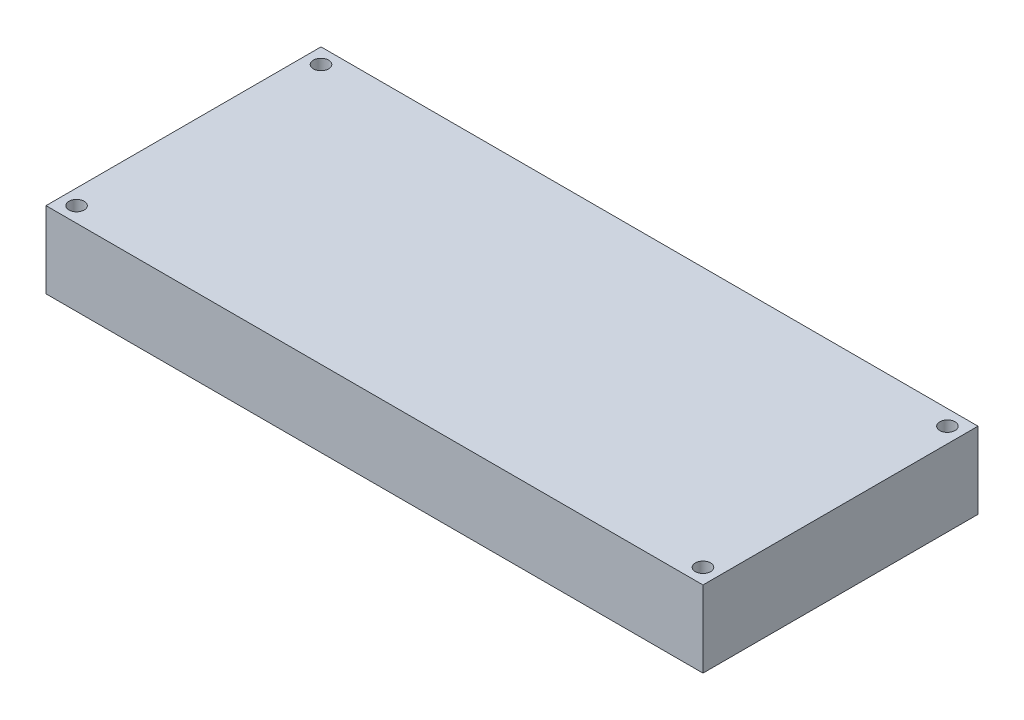
ISO-10303-21;
HEADER;
FILE_DESCRIPTION(('STEP AP214'),'2;1');
FILE_NAME('part.step','',(''),(''),'','','');
FILE_SCHEMA(('AUTOMOTIVE_DESIGN { 1 0 10303 214 1 1 1 1 }'));
ENDSEC;
DATA;
#1=APPLICATION_CONTEXT('core data for automotive mechanical design processes');
#2=APPLICATION_PROTOCOL_DEFINITION('international standard','automotive_design',2000,#1);
#3=PRODUCT_CONTEXT('',#1,'mechanical');
#4=PRODUCT('Part','Part','',(#3));
#5=PRODUCT_RELATED_PRODUCT_CATEGORY('part','',(#4));
#6=PRODUCT_DEFINITION_FORMATION('','',#4);
#7=PRODUCT_DEFINITION_CONTEXT('part definition',#1,'design');
#8=PRODUCT_DEFINITION('design','',#6,#7);
#9=PRODUCT_DEFINITION_SHAPE('','',#8);
#10=(LENGTH_UNIT() NAMED_UNIT(*) SI_UNIT(.MILLI.,.METRE.));
#11=(NAMED_UNIT(*) PLANE_ANGLE_UNIT() SI_UNIT($,.RADIAN.));
#12=(NAMED_UNIT(*) SI_UNIT($,.STERADIAN.) SOLID_ANGLE_UNIT());
#13=UNCERTAINTY_MEASURE_WITH_UNIT(LENGTH_MEASURE(1.E-05),#10,'distance_accuracy_value','');
#14=(GEOMETRIC_REPRESENTATION_CONTEXT(3) GLOBAL_UNCERTAINTY_ASSIGNED_CONTEXT((#13)) GLOBAL_UNIT_ASSIGNED_CONTEXT((#10,
#11,#12)) REPRESENTATION_CONTEXT('',''));
#15=CARTESIAN_POINT('',(0.,0.,0.));
#16=DIRECTION('',(0.,0.,1.));
#17=DIRECTION('',(1.,0.,0.));
#18=AXIS2_PLACEMENT_3D('',#15,#16,#17);
#19=CARTESIAN_POINT('',(21.5,5.,9.));
#20=DIRECTION('',(-1.,0.,0.));
#21=DIRECTION('',(0.,0.,1.));
#22=AXIS2_PLACEMENT_3D('',#19,#20,#21);
#23=PLANE('',#22);
#24=DIRECTION('',(0.,0.,-1.));
#25=VECTOR('',#24,1.);
#26=CARTESIAN_POINT('',(21.5,0.,9.));
#27=LINE('',#26,#25);
#28=CARTESIAN_POINT('',(21.5,0.,9.));
#29=VERTEX_POINT('',#28);
#30=CARTESIAN_POINT('',(21.5,0.,-9.));
#31=VERTEX_POINT('',#30);
#32=EDGE_CURVE('E99',#29,#31,#27,.T.);
#33=ORIENTED_EDGE('',*,*,#32,.T.);
#34=DIRECTION('',(0.,-1.,0.));
#35=VECTOR('',#34,1.);
#36=CARTESIAN_POINT('',(21.5,5.,-9.));
#37=LINE('',#36,#35);
#38=CARTESIAN_POINT('',(21.5,5.,-9.));
#39=VERTEX_POINT('',#38);
#40=EDGE_CURVE('E11',#39,#31,#37,.T.);
#41=ORIENTED_EDGE('',*,*,#40,.F.);
#42=DIRECTION('',(0.,0.,-1.));
#43=VECTOR('',#42,1.);
#44=CARTESIAN_POINT('',(21.5,5.,9.));
#45=LINE('',#44,#43);
#46=CARTESIAN_POINT('',(21.5,5.,9.));
#47=VERTEX_POINT('',#46);
#48=EDGE_CURVE('E87',#47,#39,#45,.T.);
#49=ORIENTED_EDGE('',*,*,#48,.F.);
#50=DIRECTION('',(0.,-1.,0.));
#51=VECTOR('',#50,1.);
#52=CARTESIAN_POINT('',(21.5,5.,9.));
#53=LINE('',#52,#51);
#54=EDGE_CURVE('E95',#47,#29,#53,.T.);
#55=ORIENTED_EDGE('',*,*,#54,.T.);
#56=EDGE_LOOP('',(#33,#41,#49,#55));
#57=FACE_BOUND('',#56,.T.);
#58=ADVANCED_FACE('F36',(#57),#23,.F.);
#59=CARTESIAN_POINT('',(-21.5,5.,-9.));
#60=DIRECTION('',(0.,0.,1.));
#61=DIRECTION('',(1.,0.,0.));
#62=AXIS2_PLACEMENT_3D('',#59,#60,#61);
#63=PLANE('',#62);
#64=DIRECTION('',(-1.,0.,0.));
#65=VECTOR('',#64,1.);
#66=CARTESIAN_POINT('',(-21.5,0.,-9.));
#67=LINE('',#66,#65);
#68=CARTESIAN_POINT('',(-21.5,0.,-9.));
#69=VERTEX_POINT('',#68);
#70=EDGE_CURVE('E91',#31,#69,#67,.T.);
#71=ORIENTED_EDGE('',*,*,#70,.T.);
#72=DIRECTION('',(0.,-1.,0.));
#73=VECTOR('',#72,1.);
#74=CARTESIAN_POINT('',(-21.5,5.,-9.));
#75=LINE('',#74,#73);
#76=CARTESIAN_POINT('',(-21.5,5.,-9.));
#77=VERTEX_POINT('',#76);
#78=EDGE_CURVE('E44',#77,#69,#75,.T.);
#79=ORIENTED_EDGE('',*,*,#78,.F.);
#80=DIRECTION('',(-1.,0.,0.));
#81=VECTOR('',#80,1.);
#82=CARTESIAN_POINT('',(-21.5,5.,-9.));
#83=LINE('',#82,#81);
#84=EDGE_CURVE('E82',#39,#77,#83,.T.);
#85=ORIENTED_EDGE('',*,*,#84,.F.);
#86=ORIENTED_EDGE('',*,*,#40,.T.);
#87=EDGE_LOOP('',(#71,#79,#85,#86));
#88=FACE_BOUND('',#87,.T.);
#89=ADVANCED_FACE('F90',(#88),#63,.F.);
#90=CARTESIAN_POINT('',(-21.5,5.,9.));
#91=DIRECTION('',(1.,0.,0.));
#92=DIRECTION('',(0.,0.,-1.));
#93=AXIS2_PLACEMENT_3D('',#90,#91,#92);
#94=PLANE('',#93);
#95=DIRECTION('',(0.,0.,1.));
#96=VECTOR('',#95,1.);
#97=CARTESIAN_POINT('',(-21.5,0.,9.));
#98=LINE('',#97,#96);
#99=CARTESIAN_POINT('',(-21.5,0.,9.));
#100=VERTEX_POINT('',#99);
#101=EDGE_CURVE('E69',#69,#100,#98,.T.);
#102=ORIENTED_EDGE('',*,*,#101,.T.);
#103=DIRECTION('',(0.,-1.,0.));
#104=VECTOR('',#103,1.);
#105=CARTESIAN_POINT('',(-21.5,5.,9.));
#106=LINE('',#105,#104);
#107=CARTESIAN_POINT('',(-21.5,5.,9.));
#108=VERTEX_POINT('',#107);
#109=EDGE_CURVE('E92',#108,#100,#106,.T.);
#110=ORIENTED_EDGE('',*,*,#109,.F.);
#111=DIRECTION('',(0.,0.,1.));
#112=VECTOR('',#111,1.);
#113=CARTESIAN_POINT('',(-21.5,5.,9.));
#114=LINE('',#113,#112);
#115=EDGE_CURVE('E85',#77,#108,#114,.T.);
#116=ORIENTED_EDGE('',*,*,#115,.F.);
#117=ORIENTED_EDGE('',*,*,#78,.T.);
#118=EDGE_LOOP('',(#102,#110,#116,#117));
#119=FACE_BOUND('',#118,.T.);
#120=ADVANCED_FACE('F93',(#119),#94,.F.);
#121=CARTESIAN_POINT('',(-21.5,5.,9.));
#122=DIRECTION('',(0.,0.,-1.));
#123=DIRECTION('',(-1.,0.,0.));
#124=AXIS2_PLACEMENT_3D('',#121,#122,#123);
#125=PLANE('',#124);
#126=DIRECTION('',(1.,0.,0.));
#127=VECTOR('',#126,1.);
#128=CARTESIAN_POINT('',(-21.5,0.,9.));
#129=LINE('',#128,#127);
#130=EDGE_CURVE('E75',#100,#29,#129,.T.);
#131=ORIENTED_EDGE('',*,*,#130,.T.);
#132=ORIENTED_EDGE('',*,*,#54,.F.);
#133=DIRECTION('',(1.,0.,0.));
#134=VECTOR('',#133,1.);
#135=CARTESIAN_POINT('',(-21.5,5.,9.));
#136=LINE('',#135,#134);
#137=EDGE_CURVE('E52',#108,#47,#136,.T.);
#138=ORIENTED_EDGE('',*,*,#137,.F.);
#139=ORIENTED_EDGE('',*,*,#109,.T.);
#140=EDGE_LOOP('',(#131,#132,#138,#139));
#141=FACE_BOUND('',#140,.T.);
#142=ADVANCED_FACE('F107',(#141),#125,.F.);
#143=CARTESIAN_POINT('',(0.,5.,0.));
#144=DIRECTION('',(0.,-1.,0.));
#145=DIRECTION('',(0.,0.,-1.));
#146=AXIS2_PLACEMENT_3D('',#143,#144,#145);
#147=PLANE('',#146);
#148=CARTESIAN_POINT('',(-20.5,5.,8.));
#149=DIRECTION('',(0.,1.,0.));
#150=DIRECTION('',(0.,0.,1.));
#151=AXIS2_PLACEMENT_3D('',#148,#149,#150);
#152=CIRCLE('',#151,0.499999999999999);
#153=CARTESIAN_POINT('',(-20.5,5.,8.5));
#154=VERTEX_POINT('',#153);
#155=EDGE_CURVE('E119',#154,#154,#152,.T.);
#156=ORIENTED_EDGE('',*,*,#155,.F.);
#157=EDGE_LOOP('',(#156));
#158=FACE_BOUND('',#157,.T.);
#159=CARTESIAN_POINT('',(20.5,5.,8.));
#160=DIRECTION('',(0.,1.,0.));
#161=DIRECTION('',(0.,0.,1.));
#162=AXIS2_PLACEMENT_3D('',#159,#160,#161);
#163=CIRCLE('',#162,0.499999999999999);
#164=CARTESIAN_POINT('',(20.5,5.,8.5));
#165=VERTEX_POINT('',#164);
#166=EDGE_CURVE('E125',#165,#165,#163,.T.);
#167=ORIENTED_EDGE('',*,*,#166,.F.);
#168=EDGE_LOOP('',(#167));
#169=FACE_BOUND('',#168,.T.);
#170=CARTESIAN_POINT('',(20.5,5.,-8.));
#171=DIRECTION('',(0.,1.,0.));
#172=DIRECTION('',(0.,0.,1.));
#173=AXIS2_PLACEMENT_3D('',#170,#171,#172);
#174=CIRCLE('',#173,0.499999999999999);
#175=CARTESIAN_POINT('',(20.5,5.,-7.5));
#176=VERTEX_POINT('',#175);
#177=EDGE_CURVE('E131',#176,#176,#174,.T.);
#178=ORIENTED_EDGE('',*,*,#177,.F.);
#179=EDGE_LOOP('',(#178));
#180=FACE_BOUND('',#179,.T.);
#181=CARTESIAN_POINT('',(-20.5,5.,-8.));
#182=DIRECTION('',(0.,1.,0.));
#183=DIRECTION('',(0.,0.,1.));
#184=AXIS2_PLACEMENT_3D('',#181,#182,#183);
#185=CIRCLE('',#184,0.499999999999999);
#186=CARTESIAN_POINT('',(-20.5,5.,-7.5));
#187=VERTEX_POINT('',#186);
#188=EDGE_CURVE('E113',#187,#187,#185,.T.);
#189=ORIENTED_EDGE('',*,*,#188,.F.);
#190=EDGE_LOOP('',(#189));
#191=FACE_BOUND('',#190,.T.);
#192=ORIENTED_EDGE('',*,*,#48,.T.);
#193=ORIENTED_EDGE('',*,*,#84,.T.);
#194=ORIENTED_EDGE('',*,*,#115,.T.);
#195=ORIENTED_EDGE('',*,*,#137,.T.);
#196=EDGE_LOOP('',(#192,#193,#194,#195));
#197=FACE_BOUND('',#196,.T.);
#198=ADVANCED_FACE('F83',(#158,#169,#180,#191,#197),#147,.F.);
#199=CARTESIAN_POINT('',(0.,0.,0.));
#200=DIRECTION('',(0.,-1.,0.));
#201=DIRECTION('',(0.,0.,-1.));
#202=AXIS2_PLACEMENT_3D('',#199,#200,#201);
#203=PLANE('',#202);
#204=CARTESIAN_POINT('',(-20.5,0.,8.));
#205=DIRECTION('',(0.,1.,0.));
#206=DIRECTION('',(0.,0.,1.));
#207=AXIS2_PLACEMENT_3D('',#204,#205,#206);
#208=CIRCLE('',#207,0.499999999999999);
#209=CARTESIAN_POINT('',(-20.5,0.,8.5));
#210=VERTEX_POINT('',#209);
#211=EDGE_CURVE('E122',#210,#210,#208,.T.);
#212=ORIENTED_EDGE('',*,*,#211,.T.);
#213=EDGE_LOOP('',(#212));
#214=FACE_BOUND('',#213,.T.);
#215=CARTESIAN_POINT('',(20.5,0.,8.));
#216=DIRECTION('',(0.,1.,0.));
#217=DIRECTION('',(0.,0.,1.));
#218=AXIS2_PLACEMENT_3D('',#215,#216,#217);
#219=CIRCLE('',#218,0.499999999999999);
#220=CARTESIAN_POINT('',(20.5,0.,8.5));
#221=VERTEX_POINT('',#220);
#222=EDGE_CURVE('E128',#221,#221,#219,.T.);
#223=ORIENTED_EDGE('',*,*,#222,.T.);
#224=EDGE_LOOP('',(#223));
#225=FACE_BOUND('',#224,.T.);
#226=CARTESIAN_POINT('',(20.5,0.,-8.));
#227=DIRECTION('',(0.,1.,0.));
#228=DIRECTION('',(0.,0.,1.));
#229=AXIS2_PLACEMENT_3D('',#226,#227,#228);
#230=CIRCLE('',#229,0.499999999999999);
#231=CARTESIAN_POINT('',(20.5,0.,-7.5));
#232=VERTEX_POINT('',#231);
#233=EDGE_CURVE('E116',#232,#232,#230,.T.);
#234=ORIENTED_EDGE('',*,*,#233,.T.);
#235=EDGE_LOOP('',(#234));
#236=FACE_BOUND('',#235,.T.);
#237=CARTESIAN_POINT('',(-20.5,0.,-8.));
#238=DIRECTION('',(0.,1.,0.));
#239=DIRECTION('',(0.,0.,1.));
#240=AXIS2_PLACEMENT_3D('',#237,#238,#239);
#241=CIRCLE('',#240,0.499999999999999);
#242=CARTESIAN_POINT('',(-20.5,0.,-7.5));
#243=VERTEX_POINT('',#242);
#244=EDGE_CURVE('E102',#243,#243,#241,.T.);
#245=ORIENTED_EDGE('',*,*,#244,.T.);
#246=EDGE_LOOP('',(#245));
#247=FACE_BOUND('',#246,.T.);
#248=ORIENTED_EDGE('',*,*,#32,.F.);
#249=ORIENTED_EDGE('',*,*,#130,.F.);
#250=ORIENTED_EDGE('',*,*,#101,.F.);
#251=ORIENTED_EDGE('',*,*,#70,.F.);
#252=EDGE_LOOP('',(#248,#249,#250,#251));
#253=FACE_BOUND('',#252,.T.);
#254=ADVANCED_FACE('F110',(#214,#225,#236,#247,#253),#203,.T.);
#255=CARTESIAN_POINT('',(-20.5,0.,-8.));
#256=DIRECTION('',(0.,1.,0.));
#257=DIRECTION('',(0.,0.,1.));
#258=AXIS2_PLACEMENT_3D('',#255,#256,#257);
#259=CYLINDRICAL_SURFACE('',#258,0.499999999999999);
#260=ORIENTED_EDGE('',*,*,#244,.F.);
#261=EDGE_LOOP('',(#260));
#262=FACE_BOUND('',#261,.T.);
#263=ORIENTED_EDGE('',*,*,#188,.T.);
#264=EDGE_LOOP('',(#263));
#265=FACE_BOUND('',#264,.T.);
#266=ADVANCED_FACE('F143',(#262,#265),#259,.F.);
#267=CARTESIAN_POINT('',(20.5,0.,-8.));
#268=DIRECTION('',(0.,1.,0.));
#269=DIRECTION('',(0.,0.,1.));
#270=AXIS2_PLACEMENT_3D('',#267,#268,#269);
#271=CYLINDRICAL_SURFACE('',#270,0.499999999999999);
#272=ORIENTED_EDGE('',*,*,#233,.F.);
#273=EDGE_LOOP('',(#272));
#274=FACE_BOUND('',#273,.T.);
#275=ORIENTED_EDGE('',*,*,#177,.T.);
#276=EDGE_LOOP('',(#275));
#277=FACE_BOUND('',#276,.T.);
#278=ADVANCED_FACE('F139',(#274,#277),#271,.F.);
#279=CARTESIAN_POINT('',(20.5,0.,8.));
#280=DIRECTION('',(0.,1.,0.));
#281=DIRECTION('',(0.,0.,1.));
#282=AXIS2_PLACEMENT_3D('',#279,#280,#281);
#283=CYLINDRICAL_SURFACE('',#282,0.499999999999999);
#284=ORIENTED_EDGE('',*,*,#222,.F.);
#285=EDGE_LOOP('',(#284));
#286=FACE_BOUND('',#285,.T.);
#287=ORIENTED_EDGE('',*,*,#166,.T.);
#288=EDGE_LOOP('',(#287));
#289=FACE_BOUND('',#288,.T.);
#290=ADVANCED_FACE('F142',(#286,#289),#283,.F.);
#291=CARTESIAN_POINT('',(-20.5,0.,8.));
#292=DIRECTION('',(0.,1.,0.));
#293=DIRECTION('',(0.,0.,1.));
#294=AXIS2_PLACEMENT_3D('',#291,#292,#293);
#295=CYLINDRICAL_SURFACE('',#294,0.499999999999999);
#296=ORIENTED_EDGE('',*,*,#211,.F.);
#297=EDGE_LOOP('',(#296));
#298=FACE_BOUND('',#297,.T.);
#299=ORIENTED_EDGE('',*,*,#155,.T.);
#300=EDGE_LOOP('',(#299));
#301=FACE_BOUND('',#300,.T.);
#302=ADVANCED_FACE('F204',(#298,#301),#295,.F.);
#303=CLOSED_SHELL('',(#58,#89,#120,#142,#198,#254,#266,#278,#290,#302));
#304=MANIFOLD_SOLID_BREP('B2',#303);
#305=ADVANCED_BREP_SHAPE_REPRESENTATION('',(#18,#304),#14);
#306=SHAPE_DEFINITION_REPRESENTATION(#9,#305);
ENDSEC;
END-ISO-10303-21;
